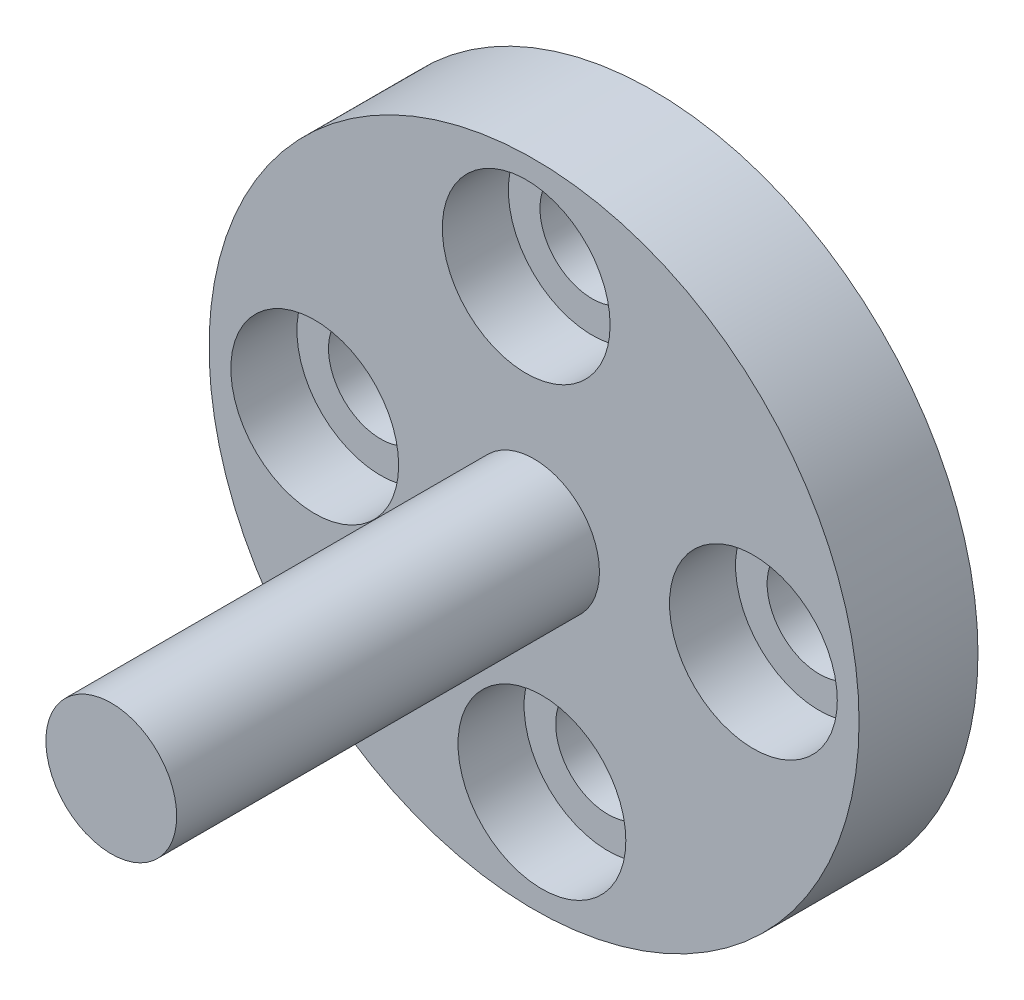
ISO-10303-21;
HEADER;
FILE_DESCRIPTION(('STEP AP214'),'2;1');
FILE_NAME('part.step','',(''),(''),'','','');
FILE_SCHEMA(('AUTOMOTIVE_DESIGN { 1 0 10303 214 1 1 1 1 }'));
ENDSEC;
DATA;
#1=APPLICATION_CONTEXT('core data for automotive mechanical design processes');
#2=APPLICATION_PROTOCOL_DEFINITION('international standard','automotive_design',2000,#1);
#3=PRODUCT_CONTEXT('',#1,'mechanical');
#4=PRODUCT('Part','Part','',(#3));
#5=PRODUCT_RELATED_PRODUCT_CATEGORY('part','',(#4));
#6=PRODUCT_DEFINITION_FORMATION('','',#4);
#7=PRODUCT_DEFINITION_CONTEXT('part definition',#1,'design');
#8=PRODUCT_DEFINITION('design','',#6,#7);
#9=PRODUCT_DEFINITION_SHAPE('','',#8);
#10=(LENGTH_UNIT() NAMED_UNIT(*) SI_UNIT(.MILLI.,.METRE.));
#11=(NAMED_UNIT(*) PLANE_ANGLE_UNIT() SI_UNIT($,.RADIAN.));
#12=(NAMED_UNIT(*) SI_UNIT($,.STERADIAN.) SOLID_ANGLE_UNIT());
#13=UNCERTAINTY_MEASURE_WITH_UNIT(LENGTH_MEASURE(1.E-05),#10,'distance_accuracy_value','');
#14=(GEOMETRIC_REPRESENTATION_CONTEXT(3) GLOBAL_UNCERTAINTY_ASSIGNED_CONTEXT((#13)) GLOBAL_UNIT_ASSIGNED_CONTEXT((#10,
#11,#12)) REPRESENTATION_CONTEXT('',''));
#15=CARTESIAN_POINT('',(0.,0.,0.));
#16=DIRECTION('',(0.,0.,1.));
#17=DIRECTION('',(1.,0.,0.));
#18=AXIS2_PLACEMENT_3D('',#15,#16,#17);
#19=CARTESIAN_POINT('',(0.,0.,2.));
#20=DIRECTION('',(0.,0.,1.));
#21=DIRECTION('',(1.,0.,0.));
#22=AXIS2_PLACEMENT_3D('',#19,#20,#21);
#23=PLANE('',#22);
#24=CARTESIAN_POINT('',(0.297454923216572,-8.3,2.));
#25=DIRECTION('',(0.,0.,1.));
#26=DIRECTION('',(1.,0.,0.));
#27=AXIS2_PLACEMENT_3D('',#24,#25,#26);
#28=CIRCLE('',#27,1.9798975704954);
#29=CARTESIAN_POINT('',(2.27735249371198,-8.3,2.));
#30=VERTEX_POINT('',#29);
#31=EDGE_CURVE('E74',#30,#30,#28,.T.);
#32=ORIENTED_EDGE('',*,*,#31,.F.);
#33=EDGE_LOOP('',(#32));
#34=FACE_BOUND('',#33,.T.);
#35=CARTESIAN_POINT('',(0.297454923216572,-8.3,2.));
#36=DIRECTION('',(0.,0.,1.));
#37=DIRECTION('',(1.,0.,0.));
#38=AXIS2_PLACEMENT_3D('',#35,#36,#37);
#39=CIRCLE('',#38,3.17542648054294);
#40=CARTESIAN_POINT('',(3.47288140375951,-8.3,2.));
#41=VERTEX_POINT('',#40);
#42=EDGE_CURVE('E91',#41,#41,#39,.T.);
#43=ORIENTED_EDGE('',*,*,#42,.T.);
#44=EDGE_LOOP('',(#43));
#45=FACE_BOUND('',#44,.T.);
#46=ADVANCED_FACE('F39',(#34,#45),#23,.T.);
#47=CARTESIAN_POINT('',(8.3,0.297454923216601,2.));
#48=DIRECTION('',(0.,0.,1.));
#49=DIRECTION('',(1.,0.,0.));
#50=AXIS2_PLACEMENT_3D('',#47,#48,#49);
#51=CIRCLE('',#50,1.9798975704954);
#52=CARTESIAN_POINT('',(10.2798975704954,0.297454923216601,2.));
#53=VERTEX_POINT('',#52);
#54=EDGE_CURVE('E68',#53,#53,#51,.T.);
#55=ORIENTED_EDGE('',*,*,#54,.F.);
#56=EDGE_LOOP('',(#55));
#57=FACE_BOUND('',#56,.T.);
#58=CARTESIAN_POINT('',(8.3,0.297454923216601,2.));
#59=DIRECTION('',(0.,0.,1.));
#60=DIRECTION('',(1.,0.,0.));
#61=AXIS2_PLACEMENT_3D('',#58,#59,#60);
#62=CIRCLE('',#61,3.17542648054294);
#63=CARTESIAN_POINT('',(11.4754264805429,0.297454923216601,2.));
#64=VERTEX_POINT('',#63);
#65=EDGE_CURVE('E88',#64,#64,#62,.T.);
#66=ORIENTED_EDGE('',*,*,#65,.T.);
#67=EDGE_LOOP('',(#66));
#68=FACE_BOUND('',#67,.T.);
#69=ADVANCED_FACE('F153',(#57,#68),#23,.T.);
#70=CARTESIAN_POINT('',(-0.29745492321663,8.3,2.));
#71=DIRECTION('',(0.,0.,1.));
#72=DIRECTION('',(1.,0.,0.));
#73=AXIS2_PLACEMENT_3D('',#70,#71,#72);
#74=CIRCLE('',#73,1.97989757049541);
#75=CARTESIAN_POINT('',(1.68244264727878,8.3,2.));
#76=VERTEX_POINT('',#75);
#77=EDGE_CURVE('E59',#76,#76,#74,.T.);
#78=ORIENTED_EDGE('',*,*,#77,.F.);
#79=EDGE_LOOP('',(#78));
#80=FACE_BOUND('',#79,.T.);
#81=CARTESIAN_POINT('',(-0.29745492321663,8.3,2.));
#82=DIRECTION('',(0.,0.,1.));
#83=DIRECTION('',(1.,0.,0.));
#84=AXIS2_PLACEMENT_3D('',#81,#82,#83);
#85=CIRCLE('',#84,3.17542648054294);
#86=CARTESIAN_POINT('',(2.87797155732631,8.3,2.));
#87=VERTEX_POINT('',#86);
#88=EDGE_CURVE('E85',#87,#87,#85,.T.);
#89=ORIENTED_EDGE('',*,*,#88,.T.);
#90=EDGE_LOOP('',(#89));
#91=FACE_BOUND('',#90,.T.);
#92=ADVANCED_FACE('F160',(#80,#91),#23,.T.);
#93=CARTESIAN_POINT('',(-8.3,-0.297454923216659,2.));
#94=DIRECTION('',(0.,0.,1.));
#95=DIRECTION('',(1.,0.,0.));
#96=AXIS2_PLACEMENT_3D('',#93,#94,#95);
#97=CIRCLE('',#96,1.9798975704954);
#98=CARTESIAN_POINT('',(-6.32010242950459,-0.297454923216659,2.));
#99=VERTEX_POINT('',#98);
#100=EDGE_CURVE('E46',#99,#99,#97,.T.);
#101=ORIENTED_EDGE('',*,*,#100,.F.);
#102=EDGE_LOOP('',(#101));
#103=FACE_BOUND('',#102,.T.);
#104=CARTESIAN_POINT('',(-8.3,-0.297454923216659,2.));
#105=DIRECTION('',(0.,0.,1.));
#106=DIRECTION('',(1.,0.,0.));
#107=AXIS2_PLACEMENT_3D('',#104,#105,#106);
#108=CIRCLE('',#107,3.17542648054294);
#109=CARTESIAN_POINT('',(-5.12457351945706,-0.297454923216659,2.));
#110=VERTEX_POINT('',#109);
#111=EDGE_CURVE('E81',#110,#110,#108,.T.);
#112=ORIENTED_EDGE('',*,*,#111,.T.);
#113=EDGE_LOOP('',(#112));
#114=FACE_BOUND('',#113,.T.);
#115=ADVANCED_FACE('F150',(#103,#114),#23,.T.);
#116=CARTESIAN_POINT('',(0.,0.,0.));
#117=DIRECTION('',(0.,0.,1.));
#118=DIRECTION('',(1.,0.,0.));
#119=AXIS2_PLACEMENT_3D('',#116,#117,#118);
#120=PLANE('',#119);
#121=CARTESIAN_POINT('',(0.,0.,0.));
#122=DIRECTION('',(0.,0.,1.));
#123=DIRECTION('',(1.,0.,0.));
#124=AXIS2_PLACEMENT_3D('',#121,#122,#123);
#125=CIRCLE('',#124,12.3);
#126=CARTESIAN_POINT('',(12.3,0.,0.));
#127=VERTEX_POINT('',#126);
#128=EDGE_CURVE('E10',#127,#127,#125,.T.);
#129=ORIENTED_EDGE('',*,*,#128,.F.);
#130=EDGE_LOOP('',(#129));
#131=FACE_BOUND('',#130,.T.);
#132=CARTESIAN_POINT('',(-8.3,-0.297454923216659,0.));
#133=DIRECTION('',(0.,0.,1.));
#134=DIRECTION('',(1.,0.,0.));
#135=AXIS2_PLACEMENT_3D('',#132,#133,#134);
#136=CIRCLE('',#135,1.9798975704954);
#137=CARTESIAN_POINT('',(-6.32010242950459,-0.297454923216659,0.));
#138=VERTEX_POINT('',#137);
#139=EDGE_CURVE('E50',#138,#138,#136,.T.);
#140=ORIENTED_EDGE('',*,*,#139,.T.);
#141=EDGE_LOOP('',(#140));
#142=FACE_BOUND('',#141,.T.);
#143=CARTESIAN_POINT('',(0.,0.,0.));
#144=DIRECTION('',(0.,0.,1.));
#145=DIRECTION('',(1.,0.,0.));
#146=AXIS2_PLACEMENT_3D('',#143,#144,#145);
#147=CIRCLE('',#146,3.);
#148=CARTESIAN_POINT('',(3.,0.,0.));
#149=VERTEX_POINT('',#148);
#150=EDGE_CURVE('E55',#149,#149,#147,.T.);
#151=ORIENTED_EDGE('',*,*,#150,.T.);
#152=EDGE_LOOP('',(#151));
#153=FACE_BOUND('',#152,.T.);
#154=CARTESIAN_POINT('',(-0.29745492321663,8.3,0.));
#155=DIRECTION('',(0.,0.,1.));
#156=DIRECTION('',(1.,0.,0.));
#157=AXIS2_PLACEMENT_3D('',#154,#155,#156);
#158=CIRCLE('',#157,1.97989757049541);
#159=CARTESIAN_POINT('',(1.68244264727878,8.3,0.));
#160=VERTEX_POINT('',#159);
#161=EDGE_CURVE('E65',#160,#160,#158,.T.);
#162=ORIENTED_EDGE('',*,*,#161,.T.);
#163=EDGE_LOOP('',(#162));
#164=FACE_BOUND('',#163,.T.);
#165=CARTESIAN_POINT('',(8.3,0.297454923216601,0.));
#166=DIRECTION('',(0.,0.,1.));
#167=DIRECTION('',(1.,0.,0.));
#168=AXIS2_PLACEMENT_3D('',#165,#166,#167);
#169=CIRCLE('',#168,1.9798975704954);
#170=CARTESIAN_POINT('',(10.2798975704954,0.297454923216601,0.));
#171=VERTEX_POINT('',#170);
#172=EDGE_CURVE('E71',#171,#171,#169,.T.);
#173=ORIENTED_EDGE('',*,*,#172,.T.);
#174=EDGE_LOOP('',(#173));
#175=FACE_BOUND('',#174,.T.);
#176=CARTESIAN_POINT('',(0.297454923216572,-8.3,0.));
#177=DIRECTION('',(0.,0.,1.));
#178=DIRECTION('',(1.,0.,0.));
#179=AXIS2_PLACEMENT_3D('',#176,#177,#178);
#180=CIRCLE('',#179,1.9798975704954);
#181=CARTESIAN_POINT('',(2.27735249371198,-8.3,0.));
#182=VERTEX_POINT('',#181);
#183=EDGE_CURVE('E63',#182,#182,#180,.T.);
#184=ORIENTED_EDGE('',*,*,#183,.T.);
#185=EDGE_LOOP('',(#184));
#186=FACE_BOUND('',#185,.T.);
#187=ADVANCED_FACE('F141',(#131,#142,#153,#164,#175,#186),#120,.F.);
#188=CARTESIAN_POINT('',(0.,0.,2.));
#189=DIRECTION('',(0.,0.,-1.));
#190=DIRECTION('',(-1.,0.,0.));
#191=AXIS2_PLACEMENT_3D('',#188,#189,#190);
#192=CYLINDRICAL_SURFACE('',#191,12.3);
#193=ORIENTED_EDGE('',*,*,#128,.T.);
#194=EDGE_LOOP('',(#193));
#195=FACE_BOUND('',#194,.T.);
#196=CARTESIAN_POINT('',(0.,0.,4.5));
#197=DIRECTION('',(0.,0.,1.));
#198=DIRECTION('',(1.,0.,0.));
#199=AXIS2_PLACEMENT_3D('',#196,#197,#198);
#200=CIRCLE('',#199,12.3);
#201=CARTESIAN_POINT('',(12.3,0.,4.5));
#202=VERTEX_POINT('',#201);
#203=EDGE_CURVE('E64',#202,#202,#200,.T.);
#204=ORIENTED_EDGE('',*,*,#203,.F.);
#205=EDGE_LOOP('',(#204));
#206=FACE_BOUND('',#205,.T.);
#207=ADVANCED_FACE('F41',(#195,#206),#192,.T.);
#208=CARTESIAN_POINT('',(-8.3,-0.297454923216659,2.));
#209=DIRECTION('',(0.,0.,-1.));
#210=DIRECTION('',(-1.,0.,0.));
#211=AXIS2_PLACEMENT_3D('',#208,#209,#210);
#212=CYLINDRICAL_SURFACE('',#211,1.9798975704954);
#213=ORIENTED_EDGE('',*,*,#100,.T.);
#214=EDGE_LOOP('',(#213));
#215=FACE_BOUND('',#214,.T.);
#216=ORIENTED_EDGE('',*,*,#139,.F.);
#217=EDGE_LOOP('',(#216));
#218=FACE_BOUND('',#217,.T.);
#219=ADVANCED_FACE('F140',(#215,#218),#212,.F.);
#220=CARTESIAN_POINT('',(0.,0.,2.));
#221=DIRECTION('',(0.,0.,-1.));
#222=DIRECTION('',(-1.,0.,0.));
#223=AXIS2_PLACEMENT_3D('',#220,#221,#222);
#224=CYLINDRICAL_SURFACE('',#223,3.);
#225=CARTESIAN_POINT('',(0.,0.,2.));
#226=DIRECTION('',(0.,0.,1.));
#227=DIRECTION('',(1.,0.,0.));
#228=AXIS2_PLACEMENT_3D('',#225,#226,#227);
#229=CIRCLE('',#228,3.);
#230=CARTESIAN_POINT('',(3.,0.,2.));
#231=VERTEX_POINT('',#230);
#232=EDGE_CURVE('E60',#231,#231,#229,.T.);
#233=ORIENTED_EDGE('',*,*,#232,.T.);
#234=EDGE_LOOP('',(#233));
#235=FACE_BOUND('',#234,.T.);
#236=ORIENTED_EDGE('',*,*,#150,.F.);
#237=EDGE_LOOP('',(#236));
#238=FACE_BOUND('',#237,.T.);
#239=ADVANCED_FACE('F147',(#235,#238),#224,.F.);
#240=CARTESIAN_POINT('',(-0.29745492321663,8.3,2.));
#241=DIRECTION('',(0.,0.,-1.));
#242=DIRECTION('',(-1.,0.,0.));
#243=AXIS2_PLACEMENT_3D('',#240,#241,#242);
#244=CYLINDRICAL_SURFACE('',#243,1.97989757049541);
#245=ORIENTED_EDGE('',*,*,#77,.T.);
#246=EDGE_LOOP('',(#245));
#247=FACE_BOUND('',#246,.T.);
#248=ORIENTED_EDGE('',*,*,#161,.F.);
#249=EDGE_LOOP('',(#248));
#250=FACE_BOUND('',#249,.T.);
#251=ADVANCED_FACE('F197',(#247,#250),#244,.F.);
#252=CARTESIAN_POINT('',(8.3,0.297454923216601,2.));
#253=DIRECTION('',(0.,0.,-1.));
#254=DIRECTION('',(-1.,0.,0.));
#255=AXIS2_PLACEMENT_3D('',#252,#253,#254);
#256=CYLINDRICAL_SURFACE('',#255,1.9798975704954);
#257=ORIENTED_EDGE('',*,*,#54,.T.);
#258=EDGE_LOOP('',(#257));
#259=FACE_BOUND('',#258,.T.);
#260=ORIENTED_EDGE('',*,*,#172,.F.);
#261=EDGE_LOOP('',(#260));
#262=FACE_BOUND('',#261,.T.);
#263=ADVANCED_FACE('F193',(#259,#262),#256,.F.);
#264=CARTESIAN_POINT('',(0.297454923216572,-8.3,2.));
#265=DIRECTION('',(0.,0.,-1.));
#266=DIRECTION('',(-1.,0.,0.));
#267=AXIS2_PLACEMENT_3D('',#264,#265,#266);
#268=CYLINDRICAL_SURFACE('',#267,1.9798975704954);
#269=ORIENTED_EDGE('',*,*,#31,.T.);
#270=EDGE_LOOP('',(#269));
#271=FACE_BOUND('',#270,.T.);
#272=ORIENTED_EDGE('',*,*,#183,.F.);
#273=EDGE_LOOP('',(#272));
#274=FACE_BOUND('',#273,.T.);
#275=ADVANCED_FACE('F127',(#271,#274),#268,.F.);
#276=CARTESIAN_POINT('',(0.,0.,4.5));
#277=DIRECTION('',(0.,0.,1.));
#278=DIRECTION('',(1.,0.,0.));
#279=AXIS2_PLACEMENT_3D('',#276,#277,#278);
#280=PLANE('',#279);
#281=CARTESIAN_POINT('',(0.,0.,4.5));
#282=DIRECTION('',(0.,0.,1.));
#283=DIRECTION('',(1.,0.,0.));
#284=AXIS2_PLACEMENT_3D('',#281,#282,#283);
#285=CIRCLE('',#284,2.475);
#286=CARTESIAN_POINT('',(2.475,0.,4.5));
#287=VERTEX_POINT('',#286);
#288=EDGE_CURVE('E108',#287,#287,#285,.T.);
#289=ORIENTED_EDGE('',*,*,#288,.F.);
#290=EDGE_LOOP('',(#289));
#291=FACE_BOUND('',#290,.T.);
#292=CARTESIAN_POINT('',(0.297454923216572,-8.3,4.5));
#293=DIRECTION('',(0.,0.,1.));
#294=DIRECTION('',(1.,0.,0.));
#295=AXIS2_PLACEMENT_3D('',#292,#293,#294);
#296=CIRCLE('',#295,3.17542648054294);
#297=CARTESIAN_POINT('',(3.47288140375951,-8.3,4.5));
#298=VERTEX_POINT('',#297);
#299=EDGE_CURVE('E84',#298,#298,#296,.T.);
#300=ORIENTED_EDGE('',*,*,#299,.F.);
#301=EDGE_LOOP('',(#300));
#302=FACE_BOUND('',#301,.T.);
#303=CARTESIAN_POINT('',(8.3,0.297454923216601,4.5));
#304=DIRECTION('',(0.,0.,1.));
#305=DIRECTION('',(1.,0.,0.));
#306=AXIS2_PLACEMENT_3D('',#303,#304,#305);
#307=CIRCLE('',#306,3.17542648054294);
#308=CARTESIAN_POINT('',(11.4754264805429,0.297454923216601,4.5));
#309=VERTEX_POINT('',#308);
#310=EDGE_CURVE('E103',#309,#309,#307,.T.);
#311=ORIENTED_EDGE('',*,*,#310,.F.);
#312=EDGE_LOOP('',(#311));
#313=FACE_BOUND('',#312,.T.);
#314=CARTESIAN_POINT('',(-0.29745492321663,8.3,4.5));
#315=DIRECTION('',(0.,0.,1.));
#316=DIRECTION('',(1.,0.,0.));
#317=AXIS2_PLACEMENT_3D('',#314,#315,#316);
#318=CIRCLE('',#317,3.17542648054294);
#319=CARTESIAN_POINT('',(2.87797155732631,8.3,4.5));
#320=VERTEX_POINT('',#319);
#321=EDGE_CURVE('E100',#320,#320,#318,.T.);
#322=ORIENTED_EDGE('',*,*,#321,.F.);
#323=EDGE_LOOP('',(#322));
#324=FACE_BOUND('',#323,.T.);
#325=CARTESIAN_POINT('',(-8.3,-0.297454923216659,4.5));
#326=DIRECTION('',(0.,0.,1.));
#327=DIRECTION('',(1.,0.,0.));
#328=AXIS2_PLACEMENT_3D('',#325,#326,#327);
#329=CIRCLE('',#328,3.17542648054294);
#330=CARTESIAN_POINT('',(-5.12457351945706,-0.297454923216659,4.5));
#331=VERTEX_POINT('',#330);
#332=EDGE_CURVE('E97',#331,#331,#329,.T.);
#333=ORIENTED_EDGE('',*,*,#332,.F.);
#334=EDGE_LOOP('',(#333));
#335=FACE_BOUND('',#334,.T.);
#336=ORIENTED_EDGE('',*,*,#203,.T.);
#337=EDGE_LOOP('',(#336));
#338=FACE_BOUND('',#337,.T.);
#339=ADVANCED_FACE('F123',(#291,#302,#313,#324,#335,#338),#280,.T.);
#340=CARTESIAN_POINT('',(0.297454923216572,-8.3,4.5));
#341=DIRECTION('',(0.,0.,-1.));
#342=DIRECTION('',(-1.,0.,0.));
#343=AXIS2_PLACEMENT_3D('',#340,#341,#342);
#344=CYLINDRICAL_SURFACE('',#343,3.17542648054294);
#345=ORIENTED_EDGE('',*,*,#299,.T.);
#346=EDGE_LOOP('',(#345));
#347=FACE_BOUND('',#346,.T.);
#348=ORIENTED_EDGE('',*,*,#42,.F.);
#349=EDGE_LOOP('',(#348));
#350=FACE_BOUND('',#349,.T.);
#351=ADVANCED_FACE('F126',(#347,#350),#344,.F.);
#352=CARTESIAN_POINT('',(8.3,0.297454923216601,4.5));
#353=DIRECTION('',(0.,0.,-1.));
#354=DIRECTION('',(-1.,0.,0.));
#355=AXIS2_PLACEMENT_3D('',#352,#353,#354);
#356=CYLINDRICAL_SURFACE('',#355,3.17542648054294);
#357=ORIENTED_EDGE('',*,*,#310,.T.);
#358=EDGE_LOOP('',(#357));
#359=FACE_BOUND('',#358,.T.);
#360=ORIENTED_EDGE('',*,*,#65,.F.);
#361=EDGE_LOOP('',(#360));
#362=FACE_BOUND('',#361,.T.);
#363=ADVANCED_FACE('F183',(#359,#362),#356,.F.);
#364=CARTESIAN_POINT('',(-0.29745492321663,8.3,4.5));
#365=DIRECTION('',(0.,0.,-1.));
#366=DIRECTION('',(-1.,0.,0.));
#367=AXIS2_PLACEMENT_3D('',#364,#365,#366);
#368=CYLINDRICAL_SURFACE('',#367,3.17542648054294);
#369=ORIENTED_EDGE('',*,*,#321,.T.);
#370=EDGE_LOOP('',(#369));
#371=FACE_BOUND('',#370,.T.);
#372=ORIENTED_EDGE('',*,*,#88,.F.);
#373=EDGE_LOOP('',(#372));
#374=FACE_BOUND('',#373,.T.);
#375=ADVANCED_FACE('F174',(#371,#374),#368,.F.);
#376=CARTESIAN_POINT('',(-8.3,-0.297454923216659,4.5));
#377=DIRECTION('',(0.,0.,-1.));
#378=DIRECTION('',(-1.,0.,0.));
#379=AXIS2_PLACEMENT_3D('',#376,#377,#378);
#380=CYLINDRICAL_SURFACE('',#379,3.17542648054294);
#381=ORIENTED_EDGE('',*,*,#332,.T.);
#382=EDGE_LOOP('',(#381));
#383=FACE_BOUND('',#382,.T.);
#384=ORIENTED_EDGE('',*,*,#111,.F.);
#385=EDGE_LOOP('',(#384));
#386=FACE_BOUND('',#385,.T.);
#387=ADVANCED_FACE('F172',(#383,#386),#380,.F.);
#388=CARTESIAN_POINT('',(0.,0.,2.));
#389=DIRECTION('',(0.,0.,1.));
#390=DIRECTION('',(1.,0.,0.));
#391=AXIS2_PLACEMENT_3D('',#388,#389,#390);
#392=PLANE('',#391);
#393=ORIENTED_EDGE('',*,*,#232,.F.);
#394=EDGE_LOOP('',(#393));
#395=FACE_BOUND('',#394,.T.);
#396=ADVANCED_FACE('F119',(#395),#392,.F.);
#397=CARTESIAN_POINT('',(0.,0.,20.5));
#398=DIRECTION('',(0.,0.,-1.));
#399=DIRECTION('',(-1.,0.,0.));
#400=AXIS2_PLACEMENT_3D('',#397,#398,#399);
#401=CYLINDRICAL_SURFACE('',#400,2.475);
#402=CARTESIAN_POINT('',(0.,0.,20.5));
#403=DIRECTION('',(0.,0.,1.));
#404=DIRECTION('',(1.,0.,0.));
#405=AXIS2_PLACEMENT_3D('',#402,#403,#404);
#406=CIRCLE('',#405,2.475);
#407=CARTESIAN_POINT('',(2.475,0.,20.5));
#408=VERTEX_POINT('',#407);
#409=EDGE_CURVE('E94',#408,#408,#406,.T.);
#410=ORIENTED_EDGE('',*,*,#409,.F.);
#411=EDGE_LOOP('',(#410));
#412=FACE_BOUND('',#411,.T.);
#413=ORIENTED_EDGE('',*,*,#288,.T.);
#414=EDGE_LOOP('',(#413));
#415=FACE_BOUND('',#414,.T.);
#416=ADVANCED_FACE('F116',(#412,#415),#401,.T.);
#417=CARTESIAN_POINT('',(0.,0.,20.5));
#418=DIRECTION('',(0.,0.,1.));
#419=DIRECTION('',(1.,0.,0.));
#420=AXIS2_PLACEMENT_3D('',#417,#418,#419);
#421=PLANE('',#420);
#422=ORIENTED_EDGE('',*,*,#409,.T.);
#423=EDGE_LOOP('',(#422));
#424=FACE_BOUND('',#423,.T.);
#425=ADVANCED_FACE('F114',(#424),#421,.T.);
#426=CLOSED_SHELL('',(#46,#69,#92,#115,#187,#207,#219,#239,#251,#263,#275,#339,#351,#363,#375,
#387,#396,#416,#425));
#427=MANIFOLD_SOLID_BREP('B2',#426);
#428=ADVANCED_BREP_SHAPE_REPRESENTATION('',(#18,#427),#14);
#429=SHAPE_DEFINITION_REPRESENTATION(#9,#428);
ENDSEC;
END-ISO-10303-21;
